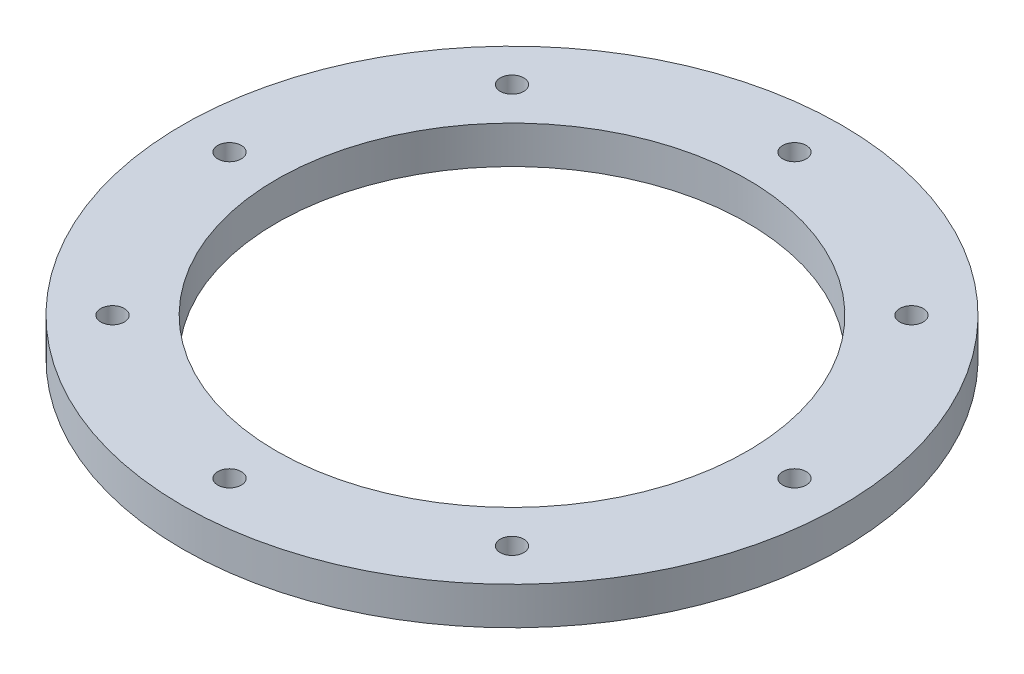
ISO-10303-21;
HEADER;
FILE_DESCRIPTION(('STEP AP214'),'2;1');
FILE_NAME('part.step','',(''),(''),'','','');
FILE_SCHEMA(('AUTOMOTIVE_DESIGN { 1 0 10303 214 1 1 1 1 }'));
ENDSEC;
DATA;
#1=APPLICATION_CONTEXT('core data for automotive mechanical design processes');
#2=APPLICATION_PROTOCOL_DEFINITION('international standard','automotive_design',2000,#1);
#3=PRODUCT_CONTEXT('',#1,'mechanical');
#4=PRODUCT('Part','Part','',(#3));
#5=PRODUCT_RELATED_PRODUCT_CATEGORY('part','',(#4));
#6=PRODUCT_DEFINITION_FORMATION('','',#4);
#7=PRODUCT_DEFINITION_CONTEXT('part definition',#1,'design');
#8=PRODUCT_DEFINITION('design','',#6,#7);
#9=PRODUCT_DEFINITION_SHAPE('','',#8);
#10=(LENGTH_UNIT() NAMED_UNIT(*) SI_UNIT(.MILLI.,.METRE.));
#11=(NAMED_UNIT(*) PLANE_ANGLE_UNIT() SI_UNIT($,.RADIAN.));
#12=(NAMED_UNIT(*) SI_UNIT($,.STERADIAN.) SOLID_ANGLE_UNIT());
#13=UNCERTAINTY_MEASURE_WITH_UNIT(LENGTH_MEASURE(1.E-05),#10,'distance_accuracy_value','');
#14=(GEOMETRIC_REPRESENTATION_CONTEXT(3) GLOBAL_UNCERTAINTY_ASSIGNED_CONTEXT((#13)) GLOBAL_UNIT_ASSIGNED_CONTEXT((#10,
#11,#12)) REPRESENTATION_CONTEXT('',''));
#15=CARTESIAN_POINT('',(0.,0.,0.));
#16=DIRECTION('',(0.,0.,1.));
#17=DIRECTION('',(1.,0.,0.));
#18=AXIS2_PLACEMENT_3D('',#15,#16,#17);
#19=CARTESIAN_POINT('',(0.,4.,0.));
#20=DIRECTION('',(0.,1.,0.));
#21=DIRECTION('',(0.,0.,1.));
#22=AXIS2_PLACEMENT_3D('',#19,#20,#21);
#23=PLANE('',#22);
#24=CARTESIAN_POINT('',(0.,4.,30.));
#25=DIRECTION('',(0.,1.,0.));
#26=DIRECTION('',(0.,0.,1.));
#27=AXIS2_PLACEMENT_3D('',#24,#25,#26);
#28=CIRCLE('',#27,1.25);
#29=CARTESIAN_POINT('',(0.,4.,31.25));
#30=VERTEX_POINT('',#29);
#31=EDGE_CURVE('E82',#30,#30,#28,.T.);
#32=ORIENTED_EDGE('',*,*,#31,.F.);
#33=EDGE_LOOP('',(#32));
#34=FACE_BOUND('',#33,.T.);
#35=CARTESIAN_POINT('',(-30.,4.,0.));
#36=DIRECTION('',(0.,1.,0.));
#37=DIRECTION('',(0.,0.,1.));
#38=AXIS2_PLACEMENT_3D('',#35,#36,#37);
#39=CIRCLE('',#38,1.25);
#40=CARTESIAN_POINT('',(-30.,4.,1.25));
#41=VERTEX_POINT('',#40);
#42=EDGE_CURVE('E70',#41,#41,#39,.T.);
#43=ORIENTED_EDGE('',*,*,#42,.F.);
#44=EDGE_LOOP('',(#43));
#45=FACE_BOUND('',#44,.T.);
#46=CARTESIAN_POINT('',(30.,4.,0.));
#47=DIRECTION('',(0.,1.,0.));
#48=DIRECTION('',(0.,0.,1.));
#49=AXIS2_PLACEMENT_3D('',#46,#47,#48);
#50=CIRCLE('',#49,1.25);
#51=CARTESIAN_POINT('',(30.,4.,1.25));
#52=VERTEX_POINT('',#51);
#53=EDGE_CURVE('E58',#52,#52,#50,.T.);
#54=ORIENTED_EDGE('',*,*,#53,.F.);
#55=EDGE_LOOP('',(#54));
#56=FACE_BOUND('',#55,.T.);
#57=CARTESIAN_POINT('',(0.,4.,-30.));
#58=DIRECTION('',(0.,1.,0.));
#59=DIRECTION('',(0.,0.,1.));
#60=AXIS2_PLACEMENT_3D('',#57,#58,#59);
#61=CIRCLE('',#60,1.25);
#62=CARTESIAN_POINT('',(0.,4.,-28.75));
#63=VERTEX_POINT('',#62);
#64=EDGE_CURVE('E46',#63,#63,#61,.T.);
#65=ORIENTED_EDGE('',*,*,#64,.F.);
#66=EDGE_LOOP('',(#65));
#67=FACE_BOUND('',#66,.T.);
#68=CARTESIAN_POINT('',(0.,4.,0.));
#69=DIRECTION('',(0.,1.,0.));
#70=DIRECTION('',(0.,0.,1.));
#71=AXIS2_PLACEMENT_3D('',#68,#69,#70);
#72=CIRCLE('',#71,35.);
#73=CARTESIAN_POINT('',(0.,4.,35.));
#74=VERTEX_POINT('',#73);
#75=EDGE_CURVE('E10',#74,#74,#72,.T.);
#76=ORIENTED_EDGE('',*,*,#75,.T.);
#77=EDGE_LOOP('',(#76));
#78=FACE_BOUND('',#77,.T.);
#79=CARTESIAN_POINT('',(0.,4.,0.));
#80=DIRECTION('',(0.,1.,0.));
#81=DIRECTION('',(0.,0.,1.));
#82=AXIS2_PLACEMENT_3D('',#79,#80,#81);
#83=CIRCLE('',#82,25.);
#84=CARTESIAN_POINT('',(0.,4.,25.));
#85=VERTEX_POINT('',#84);
#86=EDGE_CURVE('E41',#85,#85,#83,.T.);
#87=ORIENTED_EDGE('',*,*,#86,.F.);
#88=EDGE_LOOP('',(#87));
#89=FACE_BOUND('',#88,.T.);
#90=CARTESIAN_POINT('',(21.2132034355964,4.,-21.2132034355965));
#91=DIRECTION('',(0.,1.,0.));
#92=DIRECTION('',(0.,0.,1.));
#93=AXIS2_PLACEMENT_3D('',#90,#91,#92);
#94=CIRCLE('',#93,1.25);
#95=CARTESIAN_POINT('',(21.2132034355964,4.,-19.9632034355965));
#96=VERTEX_POINT('',#95);
#97=EDGE_CURVE('E52',#96,#96,#94,.T.);
#98=ORIENTED_EDGE('',*,*,#97,.F.);
#99=EDGE_LOOP('',(#98));
#100=FACE_BOUND('',#99,.T.);
#101=CARTESIAN_POINT('',(-21.2132034355964,4.,-21.2132034355965));
#102=DIRECTION('',(0.,1.,0.));
#103=DIRECTION('',(0.,0.,1.));
#104=AXIS2_PLACEMENT_3D('',#101,#102,#103);
#105=CIRCLE('',#104,1.25);
#106=CARTESIAN_POINT('',(-21.2132034355964,4.,-19.9632034355965));
#107=VERTEX_POINT('',#106);
#108=EDGE_CURVE('E64',#107,#107,#105,.T.);
#109=ORIENTED_EDGE('',*,*,#108,.F.);
#110=EDGE_LOOP('',(#109));
#111=FACE_BOUND('',#110,.T.);
#112=CARTESIAN_POINT('',(-21.2132034355965,4.,21.2132034355964));
#113=DIRECTION('',(0.,1.,0.));
#114=DIRECTION('',(0.,0.,1.));
#115=AXIS2_PLACEMENT_3D('',#112,#113,#114);
#116=CIRCLE('',#115,1.25);
#117=CARTESIAN_POINT('',(-21.2132034355965,4.,22.4632034355964));
#118=VERTEX_POINT('',#117);
#119=EDGE_CURVE('E76',#118,#118,#116,.T.);
#120=ORIENTED_EDGE('',*,*,#119,.F.);
#121=EDGE_LOOP('',(#120));
#122=FACE_BOUND('',#121,.T.);
#123=CARTESIAN_POINT('',(21.2132034355967,4.,21.2132034355962));
#124=DIRECTION('',(0.,1.,0.));
#125=DIRECTION('',(0.,0.,1.));
#126=AXIS2_PLACEMENT_3D('',#123,#124,#125);
#127=CIRCLE('',#126,1.25);
#128=CARTESIAN_POINT('',(21.2132034355967,4.,22.4632034355962));
#129=VERTEX_POINT('',#128);
#130=EDGE_CURVE('E88',#129,#129,#127,.T.);
#131=ORIENTED_EDGE('',*,*,#130,.F.);
#132=EDGE_LOOP('',(#131));
#133=FACE_BOUND('',#132,.T.);
#134=ADVANCED_FACE('F30',(#34,#45,#56,#67,#78,#89,#100,#111,#122,#133),#23,.T.);
#135=CARTESIAN_POINT('',(0.,0.,0.));
#136=DIRECTION('',(0.,1.,0.));
#137=DIRECTION('',(0.,0.,1.));
#138=AXIS2_PLACEMENT_3D('',#135,#136,#137);
#139=PLANE('',#138);
#140=CARTESIAN_POINT('',(0.,0.,0.));
#141=DIRECTION('',(0.,1.,0.));
#142=DIRECTION('',(0.,0.,1.));
#143=AXIS2_PLACEMENT_3D('',#140,#141,#142);
#144=CIRCLE('',#143,35.);
#145=CARTESIAN_POINT('',(0.,0.,35.));
#146=VERTEX_POINT('',#145);
#147=EDGE_CURVE('E34',#146,#146,#144,.T.);
#148=ORIENTED_EDGE('',*,*,#147,.F.);
#149=EDGE_LOOP('',(#148));
#150=FACE_BOUND('',#149,.T.);
#151=CARTESIAN_POINT('',(0.,0.,0.));
#152=DIRECTION('',(0.,1.,0.));
#153=DIRECTION('',(0.,0.,1.));
#154=AXIS2_PLACEMENT_3D('',#151,#152,#153);
#155=CIRCLE('',#154,25.);
#156=CARTESIAN_POINT('',(0.,0.,25.));
#157=VERTEX_POINT('',#156);
#158=EDGE_CURVE('E43',#157,#157,#155,.T.);
#159=ORIENTED_EDGE('',*,*,#158,.T.);
#160=EDGE_LOOP('',(#159));
#161=FACE_BOUND('',#160,.T.);
#162=CARTESIAN_POINT('',(0.,0.,-30.));
#163=DIRECTION('',(0.,1.,0.));
#164=DIRECTION('',(0.,0.,1.));
#165=AXIS2_PLACEMENT_3D('',#162,#163,#164);
#166=CIRCLE('',#165,1.25);
#167=CARTESIAN_POINT('',(0.,0.,-28.75));
#168=VERTEX_POINT('',#167);
#169=EDGE_CURVE('E49',#168,#168,#166,.T.);
#170=ORIENTED_EDGE('',*,*,#169,.T.);
#171=EDGE_LOOP('',(#170));
#172=FACE_BOUND('',#171,.T.);
#173=CARTESIAN_POINT('',(21.2132034355964,0.,-21.2132034355965));
#174=DIRECTION('',(0.,1.,0.));
#175=DIRECTION('',(0.,0.,1.));
#176=AXIS2_PLACEMENT_3D('',#173,#174,#175);
#177=CIRCLE('',#176,1.25);
#178=CARTESIAN_POINT('',(21.2132034355964,0.,-19.9632034355965));
#179=VERTEX_POINT('',#178);
#180=EDGE_CURVE('E55',#179,#179,#177,.T.);
#181=ORIENTED_EDGE('',*,*,#180,.T.);
#182=EDGE_LOOP('',(#181));
#183=FACE_BOUND('',#182,.T.);
#184=CARTESIAN_POINT('',(30.,0.,0.));
#185=DIRECTION('',(0.,1.,0.));
#186=DIRECTION('',(0.,0.,1.));
#187=AXIS2_PLACEMENT_3D('',#184,#185,#186);
#188=CIRCLE('',#187,1.25);
#189=CARTESIAN_POINT('',(30.,0.,1.25));
#190=VERTEX_POINT('',#189);
#191=EDGE_CURVE('E61',#190,#190,#188,.T.);
#192=ORIENTED_EDGE('',*,*,#191,.T.);
#193=EDGE_LOOP('',(#192));
#194=FACE_BOUND('',#193,.T.);
#195=CARTESIAN_POINT('',(-21.2132034355964,0.,-21.2132034355965));
#196=DIRECTION('',(0.,1.,0.));
#197=DIRECTION('',(0.,0.,1.));
#198=AXIS2_PLACEMENT_3D('',#195,#196,#197);
#199=CIRCLE('',#198,1.25);
#200=CARTESIAN_POINT('',(-21.2132034355964,0.,-19.9632034355965));
#201=VERTEX_POINT('',#200);
#202=EDGE_CURVE('E67',#201,#201,#199,.T.);
#203=ORIENTED_EDGE('',*,*,#202,.T.);
#204=EDGE_LOOP('',(#203));
#205=FACE_BOUND('',#204,.T.);
#206=CARTESIAN_POINT('',(-30.,0.,0.));
#207=DIRECTION('',(0.,1.,0.));
#208=DIRECTION('',(0.,0.,1.));
#209=AXIS2_PLACEMENT_3D('',#206,#207,#208);
#210=CIRCLE('',#209,1.25);
#211=CARTESIAN_POINT('',(-30.,0.,1.25));
#212=VERTEX_POINT('',#211);
#213=EDGE_CURVE('E73',#212,#212,#210,.T.);
#214=ORIENTED_EDGE('',*,*,#213,.T.);
#215=EDGE_LOOP('',(#214));
#216=FACE_BOUND('',#215,.T.);
#217=CARTESIAN_POINT('',(-21.2132034355965,0.,21.2132034355964));
#218=DIRECTION('',(0.,1.,0.));
#219=DIRECTION('',(0.,0.,1.));
#220=AXIS2_PLACEMENT_3D('',#217,#218,#219);
#221=CIRCLE('',#220,1.25);
#222=CARTESIAN_POINT('',(-21.2132034355965,0.,22.4632034355964));
#223=VERTEX_POINT('',#222);
#224=EDGE_CURVE('E79',#223,#223,#221,.T.);
#225=ORIENTED_EDGE('',*,*,#224,.T.);
#226=EDGE_LOOP('',(#225));
#227=FACE_BOUND('',#226,.T.);
#228=CARTESIAN_POINT('',(0.,0.,30.));
#229=DIRECTION('',(0.,1.,0.));
#230=DIRECTION('',(0.,0.,1.));
#231=AXIS2_PLACEMENT_3D('',#228,#229,#230);
#232=CIRCLE('',#231,1.25);
#233=CARTESIAN_POINT('',(0.,0.,31.25));
#234=VERTEX_POINT('',#233);
#235=EDGE_CURVE('E85',#234,#234,#232,.T.);
#236=ORIENTED_EDGE('',*,*,#235,.T.);
#237=EDGE_LOOP('',(#236));
#238=FACE_BOUND('',#237,.T.);
#239=CARTESIAN_POINT('',(21.2132034355967,0.,21.2132034355962));
#240=DIRECTION('',(0.,1.,0.));
#241=DIRECTION('',(0.,0.,1.));
#242=AXIS2_PLACEMENT_3D('',#239,#240,#241);
#243=CIRCLE('',#242,1.25);
#244=CARTESIAN_POINT('',(21.2132034355967,0.,22.4632034355962));
#245=VERTEX_POINT('',#244);
#246=EDGE_CURVE('E91',#245,#245,#243,.T.);
#247=ORIENTED_EDGE('',*,*,#246,.T.);
#248=EDGE_LOOP('',(#247));
#249=FACE_BOUND('',#248,.T.);
#250=ADVANCED_FACE('F101',(#150,#161,#172,#183,#194,#205,#216,#227,#238,#249),#139,.F.);
#251=CARTESIAN_POINT('',(0.,4.,0.));
#252=DIRECTION('',(0.,-1.,0.));
#253=DIRECTION('',(0.,0.,-1.));
#254=AXIS2_PLACEMENT_3D('',#251,#252,#253);
#255=CYLINDRICAL_SURFACE('',#254,35.);
#256=ORIENTED_EDGE('',*,*,#75,.F.);
#257=EDGE_LOOP('',(#256));
#258=FACE_BOUND('',#257,.T.);
#259=ORIENTED_EDGE('',*,*,#147,.T.);
#260=EDGE_LOOP('',(#259));
#261=FACE_BOUND('',#260,.T.);
#262=ADVANCED_FACE('F32',(#258,#261),#255,.T.);
#263=CARTESIAN_POINT('',(0.,4.,0.));
#264=DIRECTION('',(0.,-1.,0.));
#265=DIRECTION('',(0.,0.,-1.));
#266=AXIS2_PLACEMENT_3D('',#263,#264,#265);
#267=CYLINDRICAL_SURFACE('',#266,25.);
#268=ORIENTED_EDGE('',*,*,#86,.T.);
#269=EDGE_LOOP('',(#268));
#270=FACE_BOUND('',#269,.T.);
#271=ORIENTED_EDGE('',*,*,#158,.F.);
#272=EDGE_LOOP('',(#271));
#273=FACE_BOUND('',#272,.T.);
#274=ADVANCED_FACE('F111',(#270,#273),#267,.F.);
#275=CARTESIAN_POINT('',(0.,4.,-30.));
#276=DIRECTION('',(0.,-1.,0.));
#277=DIRECTION('',(0.,0.,-1.));
#278=AXIS2_PLACEMENT_3D('',#275,#276,#277);
#279=CYLINDRICAL_SURFACE('',#278,1.25);
#280=ORIENTED_EDGE('',*,*,#64,.T.);
#281=EDGE_LOOP('',(#280));
#282=FACE_BOUND('',#281,.T.);
#283=ORIENTED_EDGE('',*,*,#169,.F.);
#284=EDGE_LOOP('',(#283));
#285=FACE_BOUND('',#284,.T.);
#286=ADVANCED_FACE('F114',(#282,#285),#279,.F.);
#287=CARTESIAN_POINT('',(21.2132034355964,4.,-21.2132034355965));
#288=DIRECTION('',(0.,-1.,0.));
#289=DIRECTION('',(0.,0.,-1.));
#290=AXIS2_PLACEMENT_3D('',#287,#288,#289);
#291=CYLINDRICAL_SURFACE('',#290,1.25);
#292=ORIENTED_EDGE('',*,*,#97,.T.);
#293=EDGE_LOOP('',(#292));
#294=FACE_BOUND('',#293,.T.);
#295=ORIENTED_EDGE('',*,*,#180,.F.);
#296=EDGE_LOOP('',(#295));
#297=FACE_BOUND('',#296,.T.);
#298=ADVANCED_FACE('F118',(#294,#297),#291,.F.);
#299=CARTESIAN_POINT('',(30.,4.,0.));
#300=DIRECTION('',(0.,-1.,0.));
#301=DIRECTION('',(0.,0.,-1.));
#302=AXIS2_PLACEMENT_3D('',#299,#300,#301);
#303=CYLINDRICAL_SURFACE('',#302,1.25);
#304=ORIENTED_EDGE('',*,*,#53,.T.);
#305=EDGE_LOOP('',(#304));
#306=FACE_BOUND('',#305,.T.);
#307=ORIENTED_EDGE('',*,*,#191,.F.);
#308=EDGE_LOOP('',(#307));
#309=FACE_BOUND('',#308,.T.);
#310=ADVANCED_FACE('F122',(#306,#309),#303,.F.);
#311=CARTESIAN_POINT('',(-21.2132034355964,4.,-21.2132034355965));
#312=DIRECTION('',(0.,-1.,0.));
#313=DIRECTION('',(0.,0.,-1.));
#314=AXIS2_PLACEMENT_3D('',#311,#312,#313);
#315=CYLINDRICAL_SURFACE('',#314,1.25);
#316=ORIENTED_EDGE('',*,*,#108,.T.);
#317=EDGE_LOOP('',(#316));
#318=FACE_BOUND('',#317,.T.);
#319=ORIENTED_EDGE('',*,*,#202,.F.);
#320=EDGE_LOOP('',(#319));
#321=FACE_BOUND('',#320,.T.);
#322=ADVANCED_FACE('F126',(#318,#321),#315,.F.);
#323=CARTESIAN_POINT('',(-30.,4.,0.));
#324=DIRECTION('',(0.,-1.,0.));
#325=DIRECTION('',(0.,0.,-1.));
#326=AXIS2_PLACEMENT_3D('',#323,#324,#325);
#327=CYLINDRICAL_SURFACE('',#326,1.25);
#328=ORIENTED_EDGE('',*,*,#42,.T.);
#329=EDGE_LOOP('',(#328));
#330=FACE_BOUND('',#329,.T.);
#331=ORIENTED_EDGE('',*,*,#213,.F.);
#332=EDGE_LOOP('',(#331));
#333=FACE_BOUND('',#332,.T.);
#334=ADVANCED_FACE('F130',(#330,#333),#327,.F.);
#335=CARTESIAN_POINT('',(-21.2132034355965,4.,21.2132034355964));
#336=DIRECTION('',(0.,-1.,0.));
#337=DIRECTION('',(0.,0.,-1.));
#338=AXIS2_PLACEMENT_3D('',#335,#336,#337);
#339=CYLINDRICAL_SURFACE('',#338,1.25);
#340=ORIENTED_EDGE('',*,*,#119,.T.);
#341=EDGE_LOOP('',(#340));
#342=FACE_BOUND('',#341,.T.);
#343=ORIENTED_EDGE('',*,*,#224,.F.);
#344=EDGE_LOOP('',(#343));
#345=FACE_BOUND('',#344,.T.);
#346=ADVANCED_FACE('F134',(#342,#345),#339,.F.);
#347=CARTESIAN_POINT('',(0.,4.,30.));
#348=DIRECTION('',(0.,-1.,0.));
#349=DIRECTION('',(0.,0.,-1.));
#350=AXIS2_PLACEMENT_3D('',#347,#348,#349);
#351=CYLINDRICAL_SURFACE('',#350,1.25);
#352=ORIENTED_EDGE('',*,*,#31,.T.);
#353=EDGE_LOOP('',(#352));
#354=FACE_BOUND('',#353,.T.);
#355=ORIENTED_EDGE('',*,*,#235,.F.);
#356=EDGE_LOOP('',(#355));
#357=FACE_BOUND('',#356,.T.);
#358=ADVANCED_FACE('F138',(#354,#357),#351,.F.);
#359=CARTESIAN_POINT('',(21.2132034355967,4.,21.2132034355962));
#360=DIRECTION('',(0.,-1.,0.));
#361=DIRECTION('',(0.,0.,-1.));
#362=AXIS2_PLACEMENT_3D('',#359,#360,#361);
#363=CYLINDRICAL_SURFACE('',#362,1.25);
#364=ORIENTED_EDGE('',*,*,#130,.T.);
#365=EDGE_LOOP('',(#364));
#366=FACE_BOUND('',#365,.T.);
#367=ORIENTED_EDGE('',*,*,#246,.F.);
#368=EDGE_LOOP('',(#367));
#369=FACE_BOUND('',#368,.T.);
#370=ADVANCED_FACE('F97',(#366,#369),#363,.F.);
#371=CLOSED_SHELL('',(#134,#250,#262,#274,#286,#298,#310,#322,#334,#346,#358,#370));
#372=MANIFOLD_SOLID_BREP('B2',#371);
#373=ADVANCED_BREP_SHAPE_REPRESENTATION('',(#18,#372),#14);
#374=SHAPE_DEFINITION_REPRESENTATION(#9,#373);
ENDSEC;
END-ISO-10303-21;
